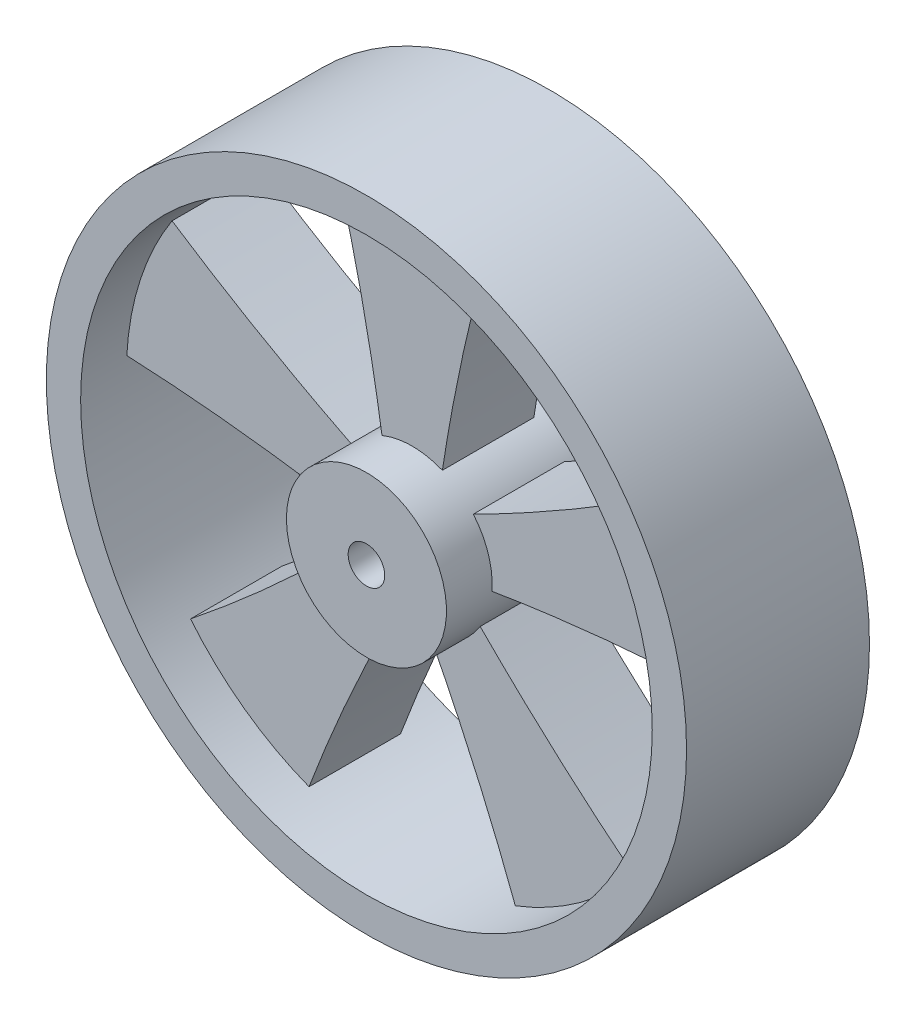
ISO-10303-21;
HEADER;
FILE_DESCRIPTION(('STEP AP214'),'2;1');
FILE_NAME('part.step','',(''),(''),'','','');
FILE_SCHEMA(('AUTOMOTIVE_DESIGN { 1 0 10303 214 1 1 1 1 }'));
ENDSEC;
DATA;
#1=APPLICATION_CONTEXT('core data for automotive mechanical design processes');
#2=APPLICATION_PROTOCOL_DEFINITION('international standard','automotive_design',2000,#1);
#3=PRODUCT_CONTEXT('',#1,'mechanical');
#4=PRODUCT('Part','Part','',(#3));
#5=PRODUCT_RELATED_PRODUCT_CATEGORY('part','',(#4));
#6=PRODUCT_DEFINITION_FORMATION('','',#4);
#7=PRODUCT_DEFINITION_CONTEXT('part definition',#1,'design');
#8=PRODUCT_DEFINITION('design','',#6,#7);
#9=PRODUCT_DEFINITION_SHAPE('','',#8);
#10=(LENGTH_UNIT() NAMED_UNIT(*) SI_UNIT(.MILLI.,.METRE.));
#11=(NAMED_UNIT(*) PLANE_ANGLE_UNIT() SI_UNIT($,.RADIAN.));
#12=(NAMED_UNIT(*) SI_UNIT($,.STERADIAN.) SOLID_ANGLE_UNIT());
#13=UNCERTAINTY_MEASURE_WITH_UNIT(LENGTH_MEASURE(1.E-05),#10,'distance_accuracy_value','');
#14=(GEOMETRIC_REPRESENTATION_CONTEXT(3) GLOBAL_UNCERTAINTY_ASSIGNED_CONTEXT((#13)) GLOBAL_UNIT_ASSIGNED_CONTEXT((#10,
#11,#12)) REPRESENTATION_CONTEXT('',''));
#15=CARTESIAN_POINT('',(0.,0.,0.));
#16=DIRECTION('',(0.,0.,1.));
#17=DIRECTION('',(1.,0.,0.));
#18=AXIS2_PLACEMENT_3D('',#15,#16,#17);
#19=CARTESIAN_POINT('',(0.,0.,-10.));
#20=DIRECTION('',(0.,0.,-1.));
#21=DIRECTION('',(-1.,0.,0.));
#22=AXIS2_PLACEMENT_3D('',#19,#20,#21);
#23=PLANE('',#22);
#24=CARTESIAN_POINT('',(0.,0.,-10.));
#25=DIRECTION('',(0.,0.,-1.));
#26=DIRECTION('',(-1.,0.,0.));
#27=AXIS2_PLACEMENT_3D('',#24,#25,#26);
#28=CIRCLE('',#27,62.5);
#29=CARTESIAN_POINT('',(-62.4052328194531,3.4404820519586,-10.));
#30=VERTEX_POINT('',#29);
#31=CARTESIAN_POINT('',(-52.5091584997812,33.897467068276,-10.));
#32=VERTEX_POINT('',#31);
#33=EDGE_CURVE('E306',#30,#32,#28,.T.);
#34=ORIENTED_EDGE('',*,*,#33,.T.);
#35=CARTESIAN_POINT('',(-52.5091584997812,33.897467068276,-10.));
#36=CARTESIAN_POINT('',(-33.6016564572668,21.4621114554993,-10.));
#37=CARTESIAN_POINT('',(-13.3724561191658,11.2883753189281,-10.));
#38=B_SPLINE_CURVE_WITH_KNOTS('',2,(#35,#36,#37),.UNSPECIFIED.,.F.,.F.,(3,3),(0.,1.),.UNSPECIFIED.);
#39=CARTESIAN_POINT('',(-13.3724561191658,11.2883753189281,-10.));
#40=VERTEX_POINT('',#39);
#41=EDGE_CURVE('E492',#32,#40,#38,.T.);
#42=ORIENTED_EDGE('',*,*,#41,.T.);
#43=CARTESIAN_POINT('',(0.,0.,-10.));
#44=DIRECTION('',(0.,0.,-1.));
#45=DIRECTION('',(-1.,0.,0.));
#46=AXIS2_PLACEMENT_3D('',#43,#44,#45);
#47=CIRCLE('',#46,17.5);
#48=CARTESIAN_POINT('',(-17.4536847917467,-1.27235497812171,-10.));
#49=VERTEX_POINT('',#48);
#50=EDGE_CURVE('E544',#49,#40,#47,.T.);
#51=ORIENTED_EDGE('',*,*,#50,.F.);
#52=CARTESIAN_POINT('',(-62.4052328194531,3.4404820519586,-10.));
#53=CARTESIAN_POINT('',(-39.7994237096774,2.3873452155112,-10.));
#54=CARTESIAN_POINT('',(-17.4536847917467,-1.27235497812171,-10.));
#55=B_SPLINE_CURVE_WITH_KNOTS('',2,(#52,#53,#54),.UNSPECIFIED.,.F.,.F.,(3,3),(0.,1.),.UNSPECIFIED.);
#56=EDGE_CURVE('E476',#30,#49,#55,.T.);
#57=ORIENTED_EDGE('',*,*,#56,.F.);
#58=EDGE_LOOP('',(#34,#42,#51,#57));
#59=FACE_BOUND('',#58,.T.);
#60=ADVANCED_FACE('F129',(#59),#23,.T.);
#61=CARTESIAN_POINT('',(-22.5563703538478,-58.28773590096,-10.));
#62=VERTEX_POINT('',#61);
#63=CARTESIAN_POINT('',(-48.4646292779443,-39.4642839660297,-10.));
#64=VERTEX_POINT('',#63);
#65=EDGE_CURVE('E298',#62,#64,#28,.T.);
#66=ORIENTED_EDGE('',*,*,#65,.T.);
#67=CARTESIAN_POINT('',(-48.4646292779443,-39.4642839660297,-10.));
#68=CARTESIAN_POINT('',(-30.7951638376495,-25.3249171570763,-10.));
#69=CARTESIAN_POINT('',(-14.8681991028074,-9.22966171857222,-10.));
#70=B_SPLINE_CURVE_WITH_KNOTS('',2,(#67,#68,#69),.UNSPECIFIED.,.F.,.F.,(3,3),(0.,1.),.UNSPECIFIED.);
#71=CARTESIAN_POINT('',(-14.8681991028074,-9.22966171857222,-10.));
#72=VERTEX_POINT('',#71);
#73=EDGE_CURVE('E427',#64,#72,#70,.T.);
#74=ORIENTED_EDGE('',*,*,#73,.T.);
#75=CARTESIAN_POINT('',(-4.18340372213,-16.9926199656695,-10.));
#76=VERTEX_POINT('',#75);
#77=EDGE_CURVE('E550',#76,#72,#47,.T.);
#78=ORIENTED_EDGE('',*,*,#77,.F.);
#79=CARTESIAN_POINT('',(-22.5563703538478,-58.2877359009599,-10.));
#80=CARTESIAN_POINT('',(-14.5691985164774,-37.1137710208479,-10.));
#81=CARTESIAN_POINT('',(-4.18340372213,-16.9926199656695,-10.));
#82=B_SPLINE_CURVE_WITH_KNOTS('',2,(#79,#80,#81),.UNSPECIFIED.,.F.,.F.,(3,3),(0.,1.),.UNSPECIFIED.);
#83=EDGE_CURVE('E282',#62,#76,#82,.T.);
#84=ORIENTED_EDGE('',*,*,#83,.F.);
#85=EDGE_LOOP('',(#66,#74,#78,#84));
#86=FACE_BOUND('',#85,.T.);
#87=ADVANCED_FACE('F346',(#86),#23,.T.);
#88=CARTESIAN_POINT('',(48.4646292779448,-39.464283966029,-10.));
#89=VERTEX_POINT('',#88);
#90=CARTESIAN_POINT('',(22.5563703538487,-58.2877359009596,-10.));
#91=VERTEX_POINT('',#90);
#92=EDGE_CURVE('E276',#89,#91,#28,.T.);
#93=ORIENTED_EDGE('',*,*,#92,.T.);
#94=CARTESIAN_POINT('',(22.5563703538487,-58.2877359009596,-10.));
#95=CARTESIAN_POINT('',(14.5691985164779,-37.1137710208477,-10.));
#96=CARTESIAN_POINT('',(4.18340372213025,-16.9926199656694,-10.));
#97=B_SPLINE_CURVE_WITH_KNOTS('',2,(#94,#95,#96),.UNSPECIFIED.,.F.,.F.,(3,3),(0.,1.),.UNSPECIFIED.);
#98=CARTESIAN_POINT('',(4.18340372213025,-16.9926199656694,-10.));
#99=VERTEX_POINT('',#98);
#100=EDGE_CURVE('E285',#91,#99,#97,.T.);
#101=ORIENTED_EDGE('',*,*,#100,.T.);
#102=CARTESIAN_POINT('',(14.8681991028075,-9.229661718572,-10.));
#103=VERTEX_POINT('',#102);
#104=EDGE_CURVE('E546',#103,#99,#47,.T.);
#105=ORIENTED_EDGE('',*,*,#104,.F.);
#106=CARTESIAN_POINT('',(48.4646292779448,-39.464283966029,-10.));
#107=CARTESIAN_POINT('',(30.7951638376499,-25.3249171570759,-10.));
#108=CARTESIAN_POINT('',(14.8681991028075,-9.229661718572,-10.));
#109=B_SPLINE_CURVE_WITH_KNOTS('',2,(#106,#107,#108),.UNSPECIFIED.,.F.,.F.,(3,3),(0.,1.),.UNSPECIFIED.);
#110=EDGE_CURVE('E295',#89,#103,#109,.T.);
#111=ORIENTED_EDGE('',*,*,#110,.F.);
#112=EDGE_LOOP('',(#93,#101,#105,#111));
#113=FACE_BOUND('',#112,.T.);
#114=ADVANCED_FACE('F294',(#113),#23,.T.);
#115=CARTESIAN_POINT('',(52.5091584997807,33.8974670682767,-10.));
#116=VERTEX_POINT('',#115);
#117=CARTESIAN_POINT('',(62.4052328194531,3.44048205195949,-10.));
#118=VERTEX_POINT('',#117);
#119=EDGE_CURVE('E297',#116,#118,#28,.T.);
#120=ORIENTED_EDGE('',*,*,#119,.T.);
#121=CARTESIAN_POINT('',(62.4052328194531,3.44048205195949,-10.));
#122=CARTESIAN_POINT('',(39.7994237096774,2.38734521551176,-10.));
#123=CARTESIAN_POINT('',(17.4536847917467,-1.27235497812146,-10.));
#124=B_SPLINE_CURVE_WITH_KNOTS('',2,(#121,#122,#123),.UNSPECIFIED.,.F.,.F.,(3,3),(0.,1.),.UNSPECIFIED.);
#125=CARTESIAN_POINT('',(17.4536847917467,-1.27235497812146,-10.));
#126=VERTEX_POINT('',#125);
#127=EDGE_CURVE('E384',#118,#126,#124,.T.);
#128=ORIENTED_EDGE('',*,*,#127,.T.);
#129=CARTESIAN_POINT('',(13.3724561191657,11.2883753189283,-10.));
#130=VERTEX_POINT('',#129);
#131=EDGE_CURVE('E543',#130,#126,#47,.T.);
#132=ORIENTED_EDGE('',*,*,#131,.F.);
#133=CARTESIAN_POINT('',(52.5091584997807,33.8974670682767,-10.));
#134=CARTESIAN_POINT('',(33.6016564572665,21.4621114554998,-10.));
#135=CARTESIAN_POINT('',(13.3724561191657,11.2883753189283,-10.));
#136=B_SPLINE_CURVE_WITH_KNOTS('',2,(#133,#134,#135),.UNSPECIFIED.,.F.,.F.,(3,3),(0.,1.),.UNSPECIFIED.);
#137=EDGE_CURVE('E387',#116,#130,#136,.T.);
#138=ORIENTED_EDGE('',*,*,#137,.F.);
#139=EDGE_LOOP('',(#120,#128,#132,#138));
#140=FACE_BOUND('',#139,.T.);
#141=ADVANCED_FACE('F359',(#140),#23,.T.);
#142=CARTESIAN_POINT('',(0.,0.,10.));
#143=DIRECTION('',(0.,0.,1.));
#144=DIRECTION('',(-1.,0.,0.));
#145=AXIS2_PLACEMENT_3D('',#142,#143,#144);
#146=PLANE('',#145);
#147=CARTESIAN_POINT('',(0.,0.,10.));
#148=DIRECTION('',(0.,0.,-1.));
#149=DIRECTION('',(-1.,0.,0.));
#150=AXIS2_PLACEMENT_3D('',#147,#148,#149);
#151=CIRCLE('',#150,17.5);
#152=CARTESIAN_POINT('',(-17.4536847917467,-1.27235497812171,10.));
#153=VERTEX_POINT('',#152);
#154=CARTESIAN_POINT('',(-13.3724561191658,11.2883753189281,10.));
#155=VERTEX_POINT('',#154);
#156=EDGE_CURVE('E583',#153,#155,#151,.T.);
#157=ORIENTED_EDGE('',*,*,#156,.T.);
#158=CARTESIAN_POINT('',(-52.5091584997812,33.897467068276,10.));
#159=CARTESIAN_POINT('',(-33.6016564572668,21.4621114554993,10.));
#160=CARTESIAN_POINT('',(-13.3724561191658,11.2883753189281,10.));
#161=B_SPLINE_CURVE_WITH_KNOTS('',2,(#158,#159,#160),.UNSPECIFIED.,.F.,.F.,(3,3),(0.,1.),.UNSPECIFIED.);
#162=CARTESIAN_POINT('',(-52.5091584997812,33.897467068276,10.));
#163=VERTEX_POINT('',#162);
#164=EDGE_CURVE('E601',#155,#163,#161,.F.);
#165=ORIENTED_EDGE('',*,*,#164,.T.);
#166=CARTESIAN_POINT('',(0.,0.,10.));
#167=DIRECTION('',(0.,0.,-1.));
#168=DIRECTION('',(-1.,0.,0.));
#169=AXIS2_PLACEMENT_3D('',#166,#167,#168);
#170=CIRCLE('',#169,62.5);
#171=CARTESIAN_POINT('',(-62.4052328194531,3.44048205195859,10.));
#172=VERTEX_POINT('',#171);
#173=EDGE_CURVE('E558',#172,#163,#170,.T.);
#174=ORIENTED_EDGE('',*,*,#173,.F.);
#175=CARTESIAN_POINT('',(-62.4052328194531,3.4404820519586,10.));
#176=CARTESIAN_POINT('',(-39.7994237096774,2.3873452155112,10.));
#177=CARTESIAN_POINT('',(-17.4536847917467,-1.27235497812171,10.));
#178=B_SPLINE_CURVE_WITH_KNOTS('',2,(#175,#176,#177),.UNSPECIFIED.,.F.,.F.,(3,3),(0.,1.),.UNSPECIFIED.);
#179=EDGE_CURVE('E626',#153,#172,#178,.F.);
#180=ORIENTED_EDGE('',*,*,#179,.F.);
#181=EDGE_LOOP('',(#157,#165,#174,#180));
#182=FACE_BOUND('',#181,.T.);
#183=ADVANCED_FACE('F369',(#182),#146,.T.);
#184=CARTESIAN_POINT('',(-4.18340372213,-16.9926199656695,10.));
#185=VERTEX_POINT('',#184);
#186=CARTESIAN_POINT('',(-14.8681991028074,-9.22966171857222,10.));
#187=VERTEX_POINT('',#186);
#188=EDGE_CURVE('E592',#185,#187,#151,.T.);
#189=ORIENTED_EDGE('',*,*,#188,.T.);
#190=CARTESIAN_POINT('',(-48.4646292779443,-39.4642839660297,10.));
#191=CARTESIAN_POINT('',(-30.7951638376495,-25.3249171570763,10.));
#192=CARTESIAN_POINT('',(-14.8681991028074,-9.22966171857222,10.));
#193=B_SPLINE_CURVE_WITH_KNOTS('',2,(#190,#191,#192),.UNSPECIFIED.,.F.,.F.,(3,3),(0.,1.),.UNSPECIFIED.);
#194=CARTESIAN_POINT('',(-48.4646292779443,-39.4642839660297,10.));
#195=VERTEX_POINT('',#194);
#196=EDGE_CURVE('E608',#187,#195,#193,.F.);
#197=ORIENTED_EDGE('',*,*,#196,.T.);
#198=CARTESIAN_POINT('',(-22.5563703538478,-58.2877359009599,10.));
#199=VERTEX_POINT('',#198);
#200=EDGE_CURVE('E564',#199,#195,#170,.T.);
#201=ORIENTED_EDGE('',*,*,#200,.F.);
#202=CARTESIAN_POINT('',(-22.5563703538478,-58.2877359009599,10.));
#203=CARTESIAN_POINT('',(-14.5691985164774,-37.1137710208479,10.));
#204=CARTESIAN_POINT('',(-4.18340372213,-16.9926199656695,10.));
#205=B_SPLINE_CURVE_WITH_KNOTS('',2,(#202,#203,#204),.UNSPECIFIED.,.F.,.F.,(3,3),(0.,1.),.UNSPECIFIED.);
#206=EDGE_CURVE('E643',#185,#199,#205,.F.);
#207=ORIENTED_EDGE('',*,*,#206,.F.);
#208=EDGE_LOOP('',(#189,#197,#201,#207));
#209=FACE_BOUND('',#208,.T.);
#210=ADVANCED_FACE('F375',(#209),#146,.T.);
#211=CARTESIAN_POINT('',(14.8681991028075,-9.229661718572,10.));
#212=VERTEX_POINT('',#211);
#213=CARTESIAN_POINT('',(4.18340372213025,-16.9926199656694,10.));
#214=VERTEX_POINT('',#213);
#215=EDGE_CURVE('E588',#212,#214,#151,.T.);
#216=ORIENTED_EDGE('',*,*,#215,.T.);
#217=CARTESIAN_POINT('',(22.5563703538487,-58.2877359009596,10.));
#218=CARTESIAN_POINT('',(14.5691985164779,-37.1137710208477,10.));
#219=CARTESIAN_POINT('',(4.18340372213025,-16.9926199656694,10.));
#220=B_SPLINE_CURVE_WITH_KNOTS('',2,(#217,#218,#219),.UNSPECIFIED.,.F.,.F.,(3,3),(0.,1.),.UNSPECIFIED.);
#221=CARTESIAN_POINT('',(22.5563703538487,-58.2877359009596,10.));
#222=VERTEX_POINT('',#221);
#223=EDGE_CURVE('E635',#214,#222,#220,.F.);
#224=ORIENTED_EDGE('',*,*,#223,.T.);
#225=CARTESIAN_POINT('',(48.4646292779448,-39.464283966029,10.));
#226=VERTEX_POINT('',#225);
#227=EDGE_CURVE('E278',#226,#222,#170,.T.);
#228=ORIENTED_EDGE('',*,*,#227,.F.);
#229=CARTESIAN_POINT('',(48.4646292779448,-39.464283966029,10.));
#230=CARTESIAN_POINT('',(30.7951638376499,-25.3249171570759,10.));
#231=CARTESIAN_POINT('',(14.8681991028075,-9.229661718572,10.));
#232=B_SPLINE_CURVE_WITH_KNOTS('',2,(#229,#230,#231),.UNSPECIFIED.,.F.,.F.,(3,3),(0.,1.),.UNSPECIFIED.);
#233=EDGE_CURVE('E659',#212,#226,#232,.F.);
#234=ORIENTED_EDGE('',*,*,#233,.F.);
#235=EDGE_LOOP('',(#216,#224,#228,#234));
#236=FACE_BOUND('',#235,.T.);
#237=ADVANCED_FACE('F789',(#236),#146,.T.);
#238=CARTESIAN_POINT('',(13.3724561191657,11.2883753189283,10.));
#239=VERTEX_POINT('',#238);
#240=CARTESIAN_POINT('',(17.4536847917467,-1.27235497812146,10.));
#241=VERTEX_POINT('',#240);
#242=EDGE_CURVE('E581',#239,#241,#151,.T.);
#243=ORIENTED_EDGE('',*,*,#242,.T.);
#244=CARTESIAN_POINT('',(62.4052328194531,3.44048205195949,10.));
#245=CARTESIAN_POINT('',(39.7994237096774,2.38734521551176,10.));
#246=CARTESIAN_POINT('',(17.4536847917467,-1.27235497812146,10.));
#247=B_SPLINE_CURVE_WITH_KNOTS('',2,(#244,#245,#246),.UNSPECIFIED.,.F.,.F.,(3,3),(0.,1.),.UNSPECIFIED.);
#248=CARTESIAN_POINT('',(62.4052328194531,3.44048205195949,10.));
#249=VERTEX_POINT('',#248);
#250=EDGE_CURVE('E651',#241,#249,#247,.F.);
#251=ORIENTED_EDGE('',*,*,#250,.T.);
#252=CARTESIAN_POINT('',(52.5091584997807,33.8974670682767,10.));
#253=VERTEX_POINT('',#252);
#254=EDGE_CURVE('E394',#253,#249,#170,.T.);
#255=ORIENTED_EDGE('',*,*,#254,.F.);
#256=CARTESIAN_POINT('',(52.5091584997807,33.8974670682767,10.));
#257=CARTESIAN_POINT('',(33.6016564572665,21.4621114554998,10.));
#258=CARTESIAN_POINT('',(13.3724561191657,11.2883753189283,10.));
#259=B_SPLINE_CURVE_WITH_KNOTS('',2,(#256,#257,#258),.UNSPECIFIED.,.F.,.F.,(3,3),(0.,1.),.UNSPECIFIED.);
#260=EDGE_CURVE('E674',#239,#253,#259,.F.);
#261=ORIENTED_EDGE('',*,*,#260,.F.);
#262=EDGE_LOOP('',(#243,#251,#255,#261));
#263=FACE_BOUND('',#262,.T.);
#264=ADVANCED_FACE('F786',(#263),#146,.T.);
#265=CARTESIAN_POINT('',(-16.0121846044243,60.4140707467543,10.));
#266=CARTESIAN_POINT('',(-10.0281980687614,38.5892315069133,10.));
#267=CARTESIAN_POINT('',(-6.60356670809647,16.2062613434351,10.));
#268=B_SPLINE_CURVE_WITH_KNOTS('',2,(#265,#266,#267),.UNSPECIFIED.,.F.,.F.,(3,3),(0.,1.),.UNSPECIFIED.);
#269=CARTESIAN_POINT('',(-6.60356670809647,16.2062613434351,10.));
#270=VERTEX_POINT('',#269);
#271=CARTESIAN_POINT('',(-16.0121846044243,60.4140707467543,10.));
#272=VERTEX_POINT('',#271);
#273=EDGE_CURVE('E605',#270,#272,#268,.F.);
#274=ORIENTED_EDGE('',*,*,#273,.F.);
#275=CARTESIAN_POINT('',(6.60356670809647,16.2062613434351,10.));
#276=VERTEX_POINT('',#275);
#277=EDGE_CURVE('E578',#270,#276,#151,.T.);
#278=ORIENTED_EDGE('',*,*,#277,.T.);
#279=CARTESIAN_POINT('',(16.0121846044243,60.4140707467543,10.));
#280=CARTESIAN_POINT('',(10.0281980687614,38.5892315069133,10.));
#281=CARTESIAN_POINT('',(6.60356670809647,16.2062613434351,10.));
#282=B_SPLINE_CURVE_WITH_KNOTS('',2,(#279,#280,#281),.UNSPECIFIED.,.F.,.F.,(3,3),(0.,1.),.UNSPECIFIED.);
#283=CARTESIAN_POINT('',(16.0121846044243,60.4140707467543,10.));
#284=VERTEX_POINT('',#283);
#285=EDGE_CURVE('E527',#276,#284,#282,.F.);
#286=ORIENTED_EDGE('',*,*,#285,.T.);
#287=EDGE_CURVE('E562',#272,#284,#170,.T.);
#288=ORIENTED_EDGE('',*,*,#287,.F.);
#289=EDGE_LOOP('',(#274,#278,#286,#288));
#290=FACE_BOUND('',#289,.T.);
#291=ADVANCED_FACE('F378',(#290),#146,.T.);
#292=CARTESIAN_POINT('',(0.,0.,20.));
#293=DIRECTION('',(0.,0.,1.));
#294=DIRECTION('',(1.,0.,0.));
#295=AXIS2_PLACEMENT_3D('',#292,#293,#294);
#296=PLANE('',#295);
#297=CARTESIAN_POINT('',(0.,0.,20.));
#298=DIRECTION('',(0.,0.,1.));
#299=DIRECTION('',(1.,0.,0.));
#300=AXIS2_PLACEMENT_3D('',#297,#298,#299);
#301=CIRCLE('',#300,4.);
#302=CARTESIAN_POINT('',(4.,0.,20.));
#303=VERTEX_POINT('',#302);
#304=EDGE_CURVE('E12',#303,#303,#301,.T.);
#305=ORIENTED_EDGE('',*,*,#304,.F.);
#306=EDGE_LOOP('',(#305));
#307=FACE_BOUND('',#306,.T.);
#308=CARTESIAN_POINT('',(0.,0.,20.));
#309=DIRECTION('',(0.,0.,-1.));
#310=DIRECTION('',(-1.,0.,0.));
#311=AXIS2_PLACEMENT_3D('',#308,#309,#310);
#312=CIRCLE('',#311,17.5);
#313=CARTESIAN_POINT('',(-17.5,0.,20.));
#314=VERTEX_POINT('',#313);
#315=EDGE_CURVE('E593',#314,#314,#312,.T.);
#316=ORIENTED_EDGE('',*,*,#315,.F.);
#317=EDGE_LOOP('',(#316));
#318=FACE_BOUND('',#317,.T.);
#319=ADVANCED_FACE('F342',(#307,#318),#296,.T.);
#320=CARTESIAN_POINT('',(0.,0.,-20.));
#321=DIRECTION('',(0.,0.,1.));
#322=DIRECTION('',(1.,0.,0.));
#323=AXIS2_PLACEMENT_3D('',#320,#321,#322);
#324=PLANE('',#323);
#325=CARTESIAN_POINT('',(0.,0.,-20.));
#326=DIRECTION('',(0.,0.,1.));
#327=DIRECTION('',(1.,0.,0.));
#328=AXIS2_PLACEMENT_3D('',#325,#326,#327);
#329=CIRCLE('',#328,4.);
#330=CARTESIAN_POINT('',(4.,0.,-20.));
#331=VERTEX_POINT('',#330);
#332=EDGE_CURVE('E133',#331,#331,#329,.T.);
#333=ORIENTED_EDGE('',*,*,#332,.T.);
#334=EDGE_LOOP('',(#333));
#335=FACE_BOUND('',#334,.T.);
#336=CARTESIAN_POINT('',(0.,0.,-20.));
#337=DIRECTION('',(0.,0.,-1.));
#338=DIRECTION('',(-1.,0.,0.));
#339=AXIS2_PLACEMENT_3D('',#336,#337,#338);
#340=CIRCLE('',#339,17.5);
#341=CARTESIAN_POINT('',(-17.5,0.,-20.));
#342=VERTEX_POINT('',#341);
#343=EDGE_CURVE('E312',#342,#342,#340,.T.);
#344=ORIENTED_EDGE('',*,*,#343,.T.);
#345=EDGE_LOOP('',(#344));
#346=FACE_BOUND('',#345,.T.);
#347=ADVANCED_FACE('F328',(#335,#346),#324,.F.);
#348=CARTESIAN_POINT('',(0.,0.,20.));
#349=DIRECTION('',(0.,0.,-1.));
#350=DIRECTION('',(-1.,0.,0.));
#351=AXIS2_PLACEMENT_3D('',#348,#349,#350);
#352=CYLINDRICAL_SURFACE('',#351,70.);
#353=CARTESIAN_POINT('',(0.,0.,20.));
#354=DIRECTION('',(0.,0.,1.));
#355=DIRECTION('',(1.,0.,0.));
#356=AXIS2_PLACEMENT_3D('',#353,#354,#355);
#357=CIRCLE('',#356,70.);
#358=CARTESIAN_POINT('',(70.,0.,20.));
#359=VERTEX_POINT('',#358);
#360=EDGE_CURVE('E139',#359,#359,#357,.T.);
#361=ORIENTED_EDGE('',*,*,#360,.F.);
#362=EDGE_LOOP('',(#361));
#363=FACE_BOUND('',#362,.T.);
#364=CARTESIAN_POINT('',(0.,0.,-20.));
#365=DIRECTION('',(0.,0.,1.));
#366=DIRECTION('',(1.,0.,0.));
#367=AXIS2_PLACEMENT_3D('',#364,#365,#366);
#368=CIRCLE('',#367,70.);
#369=CARTESIAN_POINT('',(70.,0.,-20.));
#370=VERTEX_POINT('',#369);
#371=EDGE_CURVE('E311',#370,#370,#368,.T.);
#372=ORIENTED_EDGE('',*,*,#371,.T.);
#373=EDGE_LOOP('',(#372));
#374=FACE_BOUND('',#373,.T.);
#375=ADVANCED_FACE('F131',(#363,#374),#352,.T.);
#376=CARTESIAN_POINT('',(0.,0.,20.));
#377=DIRECTION('',(0.,0.,-1.));
#378=DIRECTION('',(-1.,0.,0.));
#379=AXIS2_PLACEMENT_3D('',#376,#377,#378);
#380=CYLINDRICAL_SURFACE('',#379,4.);
#381=ORIENTED_EDGE('',*,*,#304,.T.);
#382=EDGE_LOOP('',(#381));
#383=FACE_BOUND('',#382,.T.);
#384=ORIENTED_EDGE('',*,*,#332,.F.);
#385=EDGE_LOOP('',(#384));
#386=FACE_BOUND('',#385,.T.);
#387=ADVANCED_FACE('F331',(#383,#386),#380,.F.);
#388=CARTESIAN_POINT('',(0.,0.,20.));
#389=DIRECTION('',(0.,0.,-1.));
#390=DIRECTION('',(-1.,0.,0.));
#391=AXIS2_PLACEMENT_3D('',#388,#389,#390);
#392=CIRCLE('',#391,62.5);
#393=CARTESIAN_POINT('',(-62.5,0.,20.));
#394=VERTEX_POINT('',#393);
#395=EDGE_CURVE('E572',#394,#394,#392,.T.);
#396=ORIENTED_EDGE('',*,*,#395,.T.);
#397=EDGE_LOOP('',(#396));
#398=FACE_BOUND('',#397,.T.);
#399=ORIENTED_EDGE('',*,*,#360,.T.);
#400=EDGE_LOOP('',(#399));
#401=FACE_BOUND('',#400,.T.);
#402=ADVANCED_FACE('F333',(#398,#401),#296,.T.);
#403=CARTESIAN_POINT('',(0.,0.,-20.));
#404=DIRECTION('',(0.,0.,-1.));
#405=DIRECTION('',(-1.,0.,0.));
#406=AXIS2_PLACEMENT_3D('',#403,#404,#405);
#407=CIRCLE('',#406,62.5);
#408=CARTESIAN_POINT('',(-62.5,0.,-20.));
#409=VERTEX_POINT('',#408);
#410=EDGE_CURVE('E305',#409,#409,#407,.T.);
#411=ORIENTED_EDGE('',*,*,#410,.F.);
#412=EDGE_LOOP('',(#411));
#413=FACE_BOUND('',#412,.T.);
#414=ORIENTED_EDGE('',*,*,#371,.F.);
#415=EDGE_LOOP('',(#414));
#416=FACE_BOUND('',#415,.T.);
#417=ADVANCED_FACE('F339',(#413,#416),#324,.F.);
#418=CARTESIAN_POINT('',(0.,0.,-10.));
#419=DIRECTION('',(0.,0.,-1.));
#420=DIRECTION('',(-1.,0.,0.));
#421=AXIS2_PLACEMENT_3D('',#418,#419,#420);
#422=CYLINDRICAL_SURFACE('',#421,62.5);
#423=CARTESIAN_POINT('',(-16.0121846044243,60.4140707467543,-10.));
#424=VERTEX_POINT('',#423);
#425=CARTESIAN_POINT('',(16.0121846044243,60.4140707467543,-10.));
#426=VERTEX_POINT('',#425);
#427=EDGE_CURVE('E303',#424,#426,#28,.T.);
#428=ORIENTED_EDGE('',*,*,#427,.F.);
#429=DIRECTION('',(0.,0.,-1.));
#430=VECTOR('',#429,1.);
#431=CARTESIAN_POINT('',(-16.0121846044243,60.4140707467543,20.));
#432=LINE('',#431,#430);
#433=EDGE_CURVE('E707',#272,#424,#432,.T.);
#434=ORIENTED_EDGE('',*,*,#433,.F.);
#435=ORIENTED_EDGE('',*,*,#287,.T.);
#436=DIRECTION('',(0.,0.,-1.));
#437=VECTOR('',#436,1.);
#438=CARTESIAN_POINT('',(16.0121846044243,60.4140707467543,20.));
#439=LINE('',#438,#437);
#440=EDGE_CURVE('E532',#284,#426,#439,.T.);
#441=ORIENTED_EDGE('',*,*,#440,.T.);
#442=EDGE_LOOP('',(#428,#434,#435,#441));
#443=FACE_BOUND('',#442,.T.);
#444=ORIENTED_EDGE('',*,*,#33,.F.);
#445=DIRECTION('',(0.,0.,-1.));
#446=VECTOR('',#445,1.);
#447=CARTESIAN_POINT('',(-62.4052328194531,3.4404820519586,20.));
#448=LINE('',#447,#446);
#449=EDGE_CURVE('E496',#172,#30,#448,.T.);
#450=ORIENTED_EDGE('',*,*,#449,.F.);
#451=ORIENTED_EDGE('',*,*,#173,.T.);
#452=DIRECTION('',(0.,0.,-1.));
#453=VECTOR('',#452,1.);
#454=CARTESIAN_POINT('',(-52.5091584997812,33.897467068276,20.));
#455=LINE('',#454,#453);
#456=EDGE_CURVE('E715',#163,#32,#455,.T.);
#457=ORIENTED_EDGE('',*,*,#456,.T.);
#458=EDGE_LOOP('',(#444,#450,#451,#457));
#459=FACE_BOUND('',#458,.T.);
#460=ORIENTED_EDGE('',*,*,#65,.F.);
#461=DIRECTION('',(0.,0.,-1.));
#462=VECTOR('',#461,1.);
#463=CARTESIAN_POINT('',(-22.5563703538478,-58.28773590096,20.));
#464=LINE('',#463,#462);
#465=EDGE_CURVE('E147',#199,#62,#464,.T.);
#466=ORIENTED_EDGE('',*,*,#465,.F.);
#467=ORIENTED_EDGE('',*,*,#200,.T.);
#468=DIRECTION('',(0.,0.,-1.));
#469=VECTOR('',#468,1.);
#470=CARTESIAN_POINT('',(-48.4646292779443,-39.4642839660297,20.));
#471=LINE('',#470,#469);
#472=EDGE_CURVE('E485',#195,#64,#471,.T.);
#473=ORIENTED_EDGE('',*,*,#472,.T.);
#474=EDGE_LOOP('',(#460,#466,#467,#473));
#475=FACE_BOUND('',#474,.T.);
#476=ORIENTED_EDGE('',*,*,#92,.F.);
#477=DIRECTION('',(0.,0.,-1.));
#478=VECTOR('',#477,1.);
#479=CARTESIAN_POINT('',(48.4646292779448,-39.464283966029,20.));
#480=LINE('',#479,#478);
#481=EDGE_CURVE('E155',#226,#89,#480,.T.);
#482=ORIENTED_EDGE('',*,*,#481,.F.);
#483=ORIENTED_EDGE('',*,*,#227,.T.);
#484=DIRECTION('',(0.,0.,-1.));
#485=VECTOR('',#484,1.);
#486=CARTESIAN_POINT('',(22.5563703538487,-58.2877359009596,20.));
#487=LINE('',#486,#485);
#488=EDGE_CURVE('E271',#222,#91,#487,.T.);
#489=ORIENTED_EDGE('',*,*,#488,.T.);
#490=EDGE_LOOP('',(#476,#482,#483,#489));
#491=FACE_BOUND('',#490,.T.);
#492=DIRECTION('',(0.,0.,-1.));
#493=VECTOR('',#492,1.);
#494=CARTESIAN_POINT('',(62.4052328194531,3.44048205195949,20.));
#495=LINE('',#494,#493);
#496=EDGE_CURVE('E393',#249,#118,#495,.T.);
#497=ORIENTED_EDGE('',*,*,#496,.T.);
#498=ORIENTED_EDGE('',*,*,#119,.F.);
#499=DIRECTION('',(0.,0.,-1.));
#500=VECTOR('',#499,1.);
#501=CARTESIAN_POINT('',(52.5091584997807,33.8974670682767,20.));
#502=LINE('',#501,#500);
#503=EDGE_CURVE('E391',#253,#116,#502,.T.);
#504=ORIENTED_EDGE('',*,*,#503,.F.);
#505=ORIENTED_EDGE('',*,*,#254,.T.);
#506=EDGE_LOOP('',(#497,#498,#504,#505));
#507=FACE_BOUND('',#506,.T.);
#508=ORIENTED_EDGE('',*,*,#410,.T.);
#509=EDGE_LOOP('',(#508));
#510=FACE_BOUND('',#509,.T.);
#511=ORIENTED_EDGE('',*,*,#395,.F.);
#512=EDGE_LOOP('',(#511));
#513=FACE_BOUND('',#512,.T.);
#514=ADVANCED_FACE('F273',(#443,#459,#475,#491,#507,#510,#513),#422,.F.);
#515=CARTESIAN_POINT('',(-16.0121846044243,60.4140707467543,-10.));
#516=CARTESIAN_POINT('',(-10.0281980687614,38.5892315069133,-10.));
#517=CARTESIAN_POINT('',(-6.60356670809647,16.2062613434351,-10.));
#518=B_SPLINE_CURVE_WITH_KNOTS('',2,(#515,#516,#517),.UNSPECIFIED.,.F.,.F.,(3,3),(0.,1.),.UNSPECIFIED.);
#519=CARTESIAN_POINT('',(-6.60356670809647,16.2062613434351,-10.));
#520=VERTEX_POINT('',#519);
#521=EDGE_CURVE('E710',#424,#520,#518,.T.);
#522=ORIENTED_EDGE('',*,*,#521,.F.);
#523=ORIENTED_EDGE('',*,*,#427,.T.);
#524=CARTESIAN_POINT('',(16.0121846044243,60.4140707467543,-10.));
#525=CARTESIAN_POINT('',(10.0281980687614,38.5892315069133,-10.));
#526=CARTESIAN_POINT('',(6.60356670809647,16.2062613434351,-10.));
#527=B_SPLINE_CURVE_WITH_KNOTS('',2,(#524,#525,#526),.UNSPECIFIED.,.F.,.F.,(3,3),(0.,1.),.UNSPECIFIED.);
#528=CARTESIAN_POINT('',(6.60356670809647,16.2062613434351,-10.));
#529=VERTEX_POINT('',#528);
#530=EDGE_CURVE('E524',#426,#529,#527,.T.);
#531=ORIENTED_EDGE('',*,*,#530,.T.);
#532=EDGE_CURVE('E317',#520,#529,#47,.T.);
#533=ORIENTED_EDGE('',*,*,#532,.F.);
#534=EDGE_LOOP('',(#522,#523,#531,#533));
#535=FACE_BOUND('',#534,.T.);
#536=ADVANCED_FACE('F349',(#535),#23,.T.);
#537=CARTESIAN_POINT('',(0.,0.,-10.));
#538=DIRECTION('',(0.,0.,-1.));
#539=DIRECTION('',(-1.,0.,0.));
#540=AXIS2_PLACEMENT_3D('',#537,#538,#539);
#541=CYLINDRICAL_SURFACE('',#540,17.5);
#542=DIRECTION('',(0.,0.,-1.));
#543=VECTOR('',#542,1.);
#544=CARTESIAN_POINT('',(-6.60356670809647,16.2062613434351,20.));
#545=LINE('',#544,#543);
#546=EDGE_CURVE('E540',#270,#520,#545,.T.);
#547=ORIENTED_EDGE('',*,*,#546,.T.);
#548=ORIENTED_EDGE('',*,*,#532,.T.);
#549=DIRECTION('',(0.,0.,-1.));
#550=VECTOR('',#549,1.);
#551=CARTESIAN_POINT('',(6.60356670809647,16.2062613434351,20.));
#552=LINE('',#551,#550);
#553=EDGE_CURVE('E522',#276,#529,#552,.T.);
#554=ORIENTED_EDGE('',*,*,#553,.F.);
#555=ORIENTED_EDGE('',*,*,#277,.F.);
#556=EDGE_LOOP('',(#547,#548,#554,#555));
#557=FACE_BOUND('',#556,.T.);
#558=ORIENTED_EDGE('',*,*,#77,.T.);
#559=DIRECTION('',(0.,0.,-1.));
#560=VECTOR('',#559,1.);
#561=CARTESIAN_POINT('',(-14.8681991028074,-9.22966171857222,20.));
#562=LINE('',#561,#560);
#563=EDGE_CURVE('E486',#187,#72,#562,.T.);
#564=ORIENTED_EDGE('',*,*,#563,.F.);
#565=ORIENTED_EDGE('',*,*,#188,.F.);
#566=DIRECTION('',(0.,0.,-1.));
#567=VECTOR('',#566,1.);
#568=CARTESIAN_POINT('',(-4.18340372213,-16.9926199656695,20.));
#569=LINE('',#568,#567);
#570=EDGE_CURVE('E407',#185,#76,#569,.T.);
#571=ORIENTED_EDGE('',*,*,#570,.T.);
#572=EDGE_LOOP('',(#558,#564,#565,#571));
#573=FACE_BOUND('',#572,.T.);
#574=ORIENTED_EDGE('',*,*,#104,.T.);
#575=DIRECTION('',(0.,0.,-1.));
#576=VECTOR('',#575,1.);
#577=CARTESIAN_POINT('',(4.18340372213025,-16.9926199656694,20.));
#578=LINE('',#577,#576);
#579=EDGE_CURVE('E288',#214,#99,#578,.T.);
#580=ORIENTED_EDGE('',*,*,#579,.F.);
#581=ORIENTED_EDGE('',*,*,#215,.F.);
#582=DIRECTION('',(0.,0.,-1.));
#583=VECTOR('',#582,1.);
#584=CARTESIAN_POINT('',(14.8681991028075,-9.229661718572,20.));
#585=LINE('',#584,#583);
#586=EDGE_CURVE('E428',#212,#103,#585,.T.);
#587=ORIENTED_EDGE('',*,*,#586,.T.);
#588=EDGE_LOOP('',(#574,#580,#581,#587));
#589=FACE_BOUND('',#588,.T.);
#590=ORIENTED_EDGE('',*,*,#131,.T.);
#591=DIRECTION('',(0.,0.,-1.));
#592=VECTOR('',#591,1.);
#593=CARTESIAN_POINT('',(17.4536847917467,-1.27235497812146,20.));
#594=LINE('',#593,#592);
#595=EDGE_CURVE('E401',#241,#126,#594,.T.);
#596=ORIENTED_EDGE('',*,*,#595,.F.);
#597=ORIENTED_EDGE('',*,*,#242,.F.);
#598=DIRECTION('',(0.,0.,-1.));
#599=VECTOR('',#598,1.);
#600=CARTESIAN_POINT('',(13.3724561191657,11.2883753189283,20.));
#601=LINE('',#600,#599);
#602=EDGE_CURVE('E533',#239,#130,#601,.T.);
#603=ORIENTED_EDGE('',*,*,#602,.T.);
#604=EDGE_LOOP('',(#590,#596,#597,#603));
#605=FACE_BOUND('',#604,.T.);
#606=ORIENTED_EDGE('',*,*,#50,.T.);
#607=DIRECTION('',(0.,0.,-1.));
#608=VECTOR('',#607,1.);
#609=CARTESIAN_POINT('',(-13.3724561191658,11.2883753189281,20.));
#610=LINE('',#609,#608);
#611=EDGE_CURVE('E698',#155,#40,#610,.T.);
#612=ORIENTED_EDGE('',*,*,#611,.F.);
#613=ORIENTED_EDGE('',*,*,#156,.F.);
#614=DIRECTION('',(0.,0.,-1.));
#615=VECTOR('',#614,1.);
#616=CARTESIAN_POINT('',(-17.4536847917467,-1.27235497812171,20.));
#617=LINE('',#616,#615);
#618=EDGE_CURVE('E493',#153,#49,#617,.T.);
#619=ORIENTED_EDGE('',*,*,#618,.T.);
#620=EDGE_LOOP('',(#606,#612,#613,#619));
#621=FACE_BOUND('',#620,.T.);
#622=ORIENTED_EDGE('',*,*,#343,.F.);
#623=EDGE_LOOP('',(#622));
#624=FACE_BOUND('',#623,.T.);
#625=ORIENTED_EDGE('',*,*,#315,.T.);
#626=EDGE_LOOP('',(#625));
#627=FACE_BOUND('',#626,.T.);
#628=ADVANCED_FACE('F357',(#557,#573,#589,#605,#621,#624,#627),#541,.T.);
#629=CARTESIAN_POINT('',(16.0121846044243,60.4140707467543,20.));
#630=CARTESIAN_POINT('',(10.0281980687614,38.5892315069133,20.));
#631=CARTESIAN_POINT('',(6.60356670809647,16.2062613434351,20.));
#632=B_SPLINE_CURVE_WITH_KNOTS('',2,(#629,#630,#631),.UNSPECIFIED.,.F.,.F.,(3,3),(0.,1.),.UNSPECIFIED.);
#633=DIRECTION('',(0.,0.,-1.));
#634=VECTOR('',#633,1.);
#635=SURFACE_OF_LINEAR_EXTRUSION('',#632,#634);
#636=ORIENTED_EDGE('',*,*,#553,.T.);
#637=ORIENTED_EDGE('',*,*,#530,.F.);
#638=ORIENTED_EDGE('',*,*,#440,.F.);
#639=ORIENTED_EDGE('',*,*,#285,.F.);
#640=EDGE_LOOP('',(#636,#637,#638,#639));
#641=FACE_BOUND('',#640,.T.);
#642=ADVANCED_FACE('F364',(#641),#635,.T.);
#643=CARTESIAN_POINT('',(52.5091584997807,33.8974670682767,20.));
#644=CARTESIAN_POINT('',(33.6016564572665,21.4621114554998,20.));
#645=CARTESIAN_POINT('',(13.3724561191657,11.2883753189283,20.));
#646=B_SPLINE_CURVE_WITH_KNOTS('',2,(#643,#644,#645),.UNSPECIFIED.,.F.,.F.,(3,3),(0.,1.),.UNSPECIFIED.);
#647=DIRECTION('',(0.,0.,-1.));
#648=VECTOR('',#647,1.);
#649=SURFACE_OF_LINEAR_EXTRUSION('',#646,#648);
#650=ORIENTED_EDGE('',*,*,#260,.T.);
#651=ORIENTED_EDGE('',*,*,#503,.T.);
#652=ORIENTED_EDGE('',*,*,#137,.T.);
#653=ORIENTED_EDGE('',*,*,#602,.F.);
#654=EDGE_LOOP('',(#650,#651,#652,#653));
#655=FACE_BOUND('',#654,.T.);
#656=ADVANCED_FACE('F513',(#655),#649,.F.);
#657=CARTESIAN_POINT('',(62.4052328194531,3.44048205195949,20.));
#658=CARTESIAN_POINT('',(39.7994237096774,2.38734521551176,20.));
#659=CARTESIAN_POINT('',(17.4536847917467,-1.27235497812146,20.));
#660=B_SPLINE_CURVE_WITH_KNOTS('',2,(#657,#658,#659),.UNSPECIFIED.,.F.,.F.,(3,3),(0.,1.),.UNSPECIFIED.);
#661=DIRECTION('',(0.,0.,-1.));
#662=VECTOR('',#661,1.);
#663=SURFACE_OF_LINEAR_EXTRUSION('',#660,#662);
#664=ORIENTED_EDGE('',*,*,#595,.T.);
#665=ORIENTED_EDGE('',*,*,#127,.F.);
#666=ORIENTED_EDGE('',*,*,#496,.F.);
#667=ORIENTED_EDGE('',*,*,#250,.F.);
#668=EDGE_LOOP('',(#664,#665,#666,#667));
#669=FACE_BOUND('',#668,.T.);
#670=ADVANCED_FACE('F399',(#669),#663,.T.);
#671=CARTESIAN_POINT('',(48.4646292779448,-39.464283966029,20.));
#672=CARTESIAN_POINT('',(30.7951638376499,-25.3249171570759,20.));
#673=CARTESIAN_POINT('',(14.8681991028075,-9.229661718572,20.));
#674=B_SPLINE_CURVE_WITH_KNOTS('',2,(#671,#672,#673),.UNSPECIFIED.,.F.,.F.,(3,3),(0.,1.),.UNSPECIFIED.);
#675=DIRECTION('',(0.,0.,-1.));
#676=VECTOR('',#675,1.);
#677=SURFACE_OF_LINEAR_EXTRUSION('',#674,#676);
#678=ORIENTED_EDGE('',*,*,#233,.T.);
#679=ORIENTED_EDGE('',*,*,#481,.T.);
#680=ORIENTED_EDGE('',*,*,#110,.T.);
#681=ORIENTED_EDGE('',*,*,#586,.F.);
#682=EDGE_LOOP('',(#678,#679,#680,#681));
#683=FACE_BOUND('',#682,.T.);
#684=ADVANCED_FACE('F753',(#683),#677,.F.);
#685=CARTESIAN_POINT('',(22.5563703538487,-58.2877359009596,20.));
#686=CARTESIAN_POINT('',(14.5691985164779,-37.1137710208477,20.));
#687=CARTESIAN_POINT('',(4.18340372213025,-16.9926199656694,20.));
#688=B_SPLINE_CURVE_WITH_KNOTS('',2,(#685,#686,#687),.UNSPECIFIED.,.F.,.F.,(3,3),(0.,1.),.UNSPECIFIED.);
#689=DIRECTION('',(0.,0.,-1.));
#690=VECTOR('',#689,1.);
#691=SURFACE_OF_LINEAR_EXTRUSION('',#688,#690);
#692=ORIENTED_EDGE('',*,*,#579,.T.);
#693=ORIENTED_EDGE('',*,*,#100,.F.);
#694=ORIENTED_EDGE('',*,*,#488,.F.);
#695=ORIENTED_EDGE('',*,*,#223,.F.);
#696=EDGE_LOOP('',(#692,#693,#694,#695));
#697=FACE_BOUND('',#696,.T.);
#698=ADVANCED_FACE('F286',(#697),#691,.T.);
#699=CARTESIAN_POINT('',(-22.5563703538478,-58.2877359009599,20.));
#700=CARTESIAN_POINT('',(-14.5691985164774,-37.1137710208479,20.));
#701=CARTESIAN_POINT('',(-4.18340372213,-16.9926199656695,20.));
#702=B_SPLINE_CURVE_WITH_KNOTS('',2,(#699,#700,#701),.UNSPECIFIED.,.F.,.F.,(3,3),(0.,1.),.UNSPECIFIED.);
#703=DIRECTION('',(0.,0.,-1.));
#704=VECTOR('',#703,1.);
#705=SURFACE_OF_LINEAR_EXTRUSION('',#702,#704);
#706=ORIENTED_EDGE('',*,*,#206,.T.);
#707=ORIENTED_EDGE('',*,*,#465,.T.);
#708=ORIENTED_EDGE('',*,*,#83,.T.);
#709=ORIENTED_EDGE('',*,*,#570,.F.);
#710=EDGE_LOOP('',(#706,#707,#708,#709));
#711=FACE_BOUND('',#710,.T.);
#712=ADVANCED_FACE('F759',(#711),#705,.F.);
#713=CARTESIAN_POINT('',(-48.4646292779443,-39.4642839660297,20.));
#714=CARTESIAN_POINT('',(-30.7951638376495,-25.3249171570763,20.));
#715=CARTESIAN_POINT('',(-14.8681991028074,-9.22966171857222,20.));
#716=B_SPLINE_CURVE_WITH_KNOTS('',2,(#713,#714,#715),.UNSPECIFIED.,.F.,.F.,(3,3),(0.,1.),.UNSPECIFIED.);
#717=DIRECTION('',(0.,0.,-1.));
#718=VECTOR('',#717,1.);
#719=SURFACE_OF_LINEAR_EXTRUSION('',#716,#718);
#720=ORIENTED_EDGE('',*,*,#563,.T.);
#721=ORIENTED_EDGE('',*,*,#73,.F.);
#722=ORIENTED_EDGE('',*,*,#472,.F.);
#723=ORIENTED_EDGE('',*,*,#196,.F.);
#724=EDGE_LOOP('',(#720,#721,#722,#723));
#725=FACE_BOUND('',#724,.T.);
#726=ADVANCED_FACE('F456',(#725),#719,.T.);
#727=CARTESIAN_POINT('',(-62.4052328194531,3.4404820519586,20.));
#728=CARTESIAN_POINT('',(-39.7994237096774,2.3873452155112,20.));
#729=CARTESIAN_POINT('',(-17.4536847917467,-1.27235497812171,20.));
#730=B_SPLINE_CURVE_WITH_KNOTS('',2,(#727,#728,#729),.UNSPECIFIED.,.F.,.F.,(3,3),(0.,1.),.UNSPECIFIED.);
#731=DIRECTION('',(0.,0.,-1.));
#732=VECTOR('',#731,1.);
#733=SURFACE_OF_LINEAR_EXTRUSION('',#730,#732);
#734=ORIENTED_EDGE('',*,*,#179,.T.);
#735=ORIENTED_EDGE('',*,*,#449,.T.);
#736=ORIENTED_EDGE('',*,*,#56,.T.);
#737=ORIENTED_EDGE('',*,*,#618,.F.);
#738=EDGE_LOOP('',(#734,#735,#736,#737));
#739=FACE_BOUND('',#738,.T.);
#740=ADVANCED_FACE('F450',(#739),#733,.F.);
#741=CARTESIAN_POINT('',(-52.5091584997812,33.897467068276,20.));
#742=CARTESIAN_POINT('',(-33.6016564572668,21.4621114554993,20.));
#743=CARTESIAN_POINT('',(-13.3724561191658,11.2883753189281,20.));
#744=B_SPLINE_CURVE_WITH_KNOTS('',2,(#741,#742,#743),.UNSPECIFIED.,.F.,.F.,(3,3),(0.,1.),.UNSPECIFIED.);
#745=DIRECTION('',(0.,0.,-1.));
#746=VECTOR('',#745,1.);
#747=SURFACE_OF_LINEAR_EXTRUSION('',#744,#746);
#748=ORIENTED_EDGE('',*,*,#611,.T.);
#749=ORIENTED_EDGE('',*,*,#41,.F.);
#750=ORIENTED_EDGE('',*,*,#456,.F.);
#751=ORIENTED_EDGE('',*,*,#164,.F.);
#752=EDGE_LOOP('',(#748,#749,#750,#751));
#753=FACE_BOUND('',#752,.T.);
#754=ADVANCED_FACE('F445',(#753),#747,.T.);
#755=CARTESIAN_POINT('',(-16.0121846044243,60.4140707467543,20.));
#756=CARTESIAN_POINT('',(-10.0281980687614,38.5892315069133,20.));
#757=CARTESIAN_POINT('',(-6.60356670809647,16.2062613434351,20.));
#758=B_SPLINE_CURVE_WITH_KNOTS('',2,(#755,#756,#757),.UNSPECIFIED.,.F.,.F.,(3,3),(0.,1.),.UNSPECIFIED.);
#759=DIRECTION('',(0.,0.,-1.));
#760=VECTOR('',#759,1.);
#761=SURFACE_OF_LINEAR_EXTRUSION('',#758,#760);
#762=ORIENTED_EDGE('',*,*,#273,.T.);
#763=ORIENTED_EDGE('',*,*,#433,.T.);
#764=ORIENTED_EDGE('',*,*,#521,.T.);
#765=ORIENTED_EDGE('',*,*,#546,.F.);
#766=EDGE_LOOP('',(#762,#763,#764,#765));
#767=FACE_BOUND('',#766,.T.);
#768=ADVANCED_FACE('F449',(#767),#761,.F.);
#769=CLOSED_SHELL('',(#60,#87,#114,#141,#183,#210,#237,#264,#291,#319,#347,#375,#387,#402,#417,
#514,#536,#628,#642,#656,#670,#684,#698,#712,#726,#740,#754,#768));
#770=MANIFOLD_SOLID_BREP('B2',#769);
#771=ADVANCED_BREP_SHAPE_REPRESENTATION('',(#18,#770),#14);
#772=SHAPE_DEFINITION_REPRESENTATION(#9,#771);
ENDSEC;
END-ISO-10303-21;
